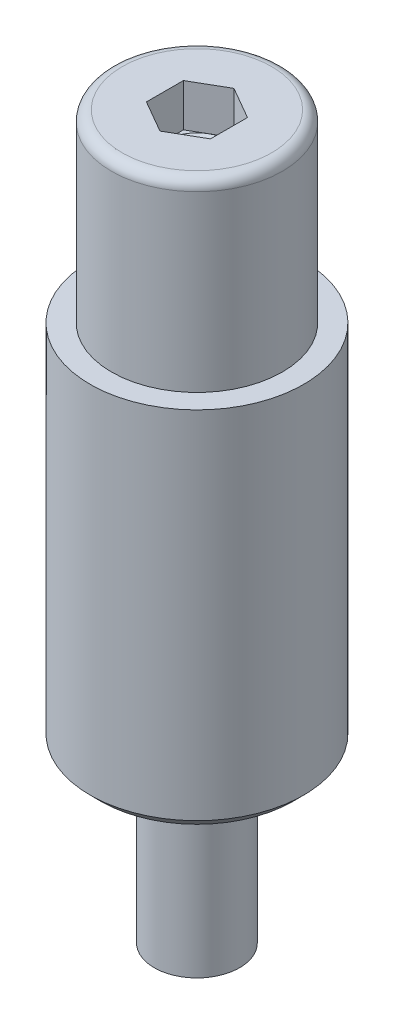
ISO-10303-21;
HEADER;
FILE_DESCRIPTION(('STEP AP214'),'2;1');
FILE_NAME('part.step','',(''),(''),'','','');
FILE_SCHEMA(('AUTOMOTIVE_DESIGN { 1 0 10303 214 1 1 1 1 }'));
ENDSEC;
DATA;
#1=APPLICATION_CONTEXT('core data for automotive mechanical design processes');
#2=APPLICATION_PROTOCOL_DEFINITION('international standard','automotive_design',2000,#1);
#3=PRODUCT_CONTEXT('',#1,'mechanical');
#4=PRODUCT('Part','Part','',(#3));
#5=PRODUCT_RELATED_PRODUCT_CATEGORY('part','',(#4));
#6=PRODUCT_DEFINITION_FORMATION('','',#4);
#7=PRODUCT_DEFINITION_CONTEXT('part definition',#1,'design');
#8=PRODUCT_DEFINITION('design','',#6,#7);
#9=PRODUCT_DEFINITION_SHAPE('','',#8);
#10=(LENGTH_UNIT() NAMED_UNIT(*) SI_UNIT(.MILLI.,.METRE.));
#11=(NAMED_UNIT(*) PLANE_ANGLE_UNIT() SI_UNIT($,.RADIAN.));
#12=(NAMED_UNIT(*) SI_UNIT($,.STERADIAN.) SOLID_ANGLE_UNIT());
#13=UNCERTAINTY_MEASURE_WITH_UNIT(LENGTH_MEASURE(1.E-05),#10,'distance_accuracy_value','');
#14=(GEOMETRIC_REPRESENTATION_CONTEXT(3) GLOBAL_UNCERTAINTY_ASSIGNED_CONTEXT((#13)) GLOBAL_UNIT_ASSIGNED_CONTEXT((#10,
#11,#12)) REPRESENTATION_CONTEXT('',''));
#15=CARTESIAN_POINT('',(0.,0.,0.));
#16=DIRECTION('',(0.,0.,1.));
#17=DIRECTION('',(1.,0.,0.));
#18=AXIS2_PLACEMENT_3D('',#15,#16,#17);
#19=CARTESIAN_POINT('',(0.,23.8,0.));
#20=DIRECTION('',(0.,1.,0.));
#21=DIRECTION('',(0.,0.,1.));
#22=AXIS2_PLACEMENT_3D('',#19,#20,#21);
#23=PLANE('',#22);
#24=DIRECTION('',(-0.866025403784439,0.,-0.5));
#25=VECTOR('',#24,1.);
#26=CARTESIAN_POINT('',(1.5,23.8,-0.86602540378444));
#27=LINE('',#26,#25);
#28=CARTESIAN_POINT('',(1.5,23.8,-0.86602540378444));
#29=VERTEX_POINT('',#28);
#30=CARTESIAN_POINT('',(0.75,23.8,-1.29903810567666));
#31=VERTEX_POINT('',#30);
#32=EDGE_CURVE('E141',#29,#31,#27,.T.);
#33=ORIENTED_EDGE('',*,*,#32,.T.);
#34=CARTESIAN_POINT('',(0.,23.8,0.));
#35=DIRECTION('',(0.,-1.,0.));
#36=DIRECTION('',(0.,0.,-1.));
#37=AXIS2_PLACEMENT_3D('',#34,#35,#36);
#38=CIRCLE('',#37,1.5);
#39=CARTESIAN_POINT('',(1.5,23.8,0.));
#40=VERTEX_POINT('',#39);
#41=EDGE_CURVE('E31',#31,#40,#38,.T.);
#42=ORIENTED_EDGE('',*,*,#41,.T.);
#43=DIRECTION('',(0.,0.,-1.));
#44=VECTOR('',#43,1.);
#45=CARTESIAN_POINT('',(1.5,23.8,0.866025403784439));
#46=LINE('',#45,#44);
#47=EDGE_CURVE('E154',#40,#29,#46,.T.);
#48=ORIENTED_EDGE('',*,*,#47,.T.);
#49=EDGE_LOOP('',(#33,#42,#48));
#50=FACE_BOUND('',#49,.T.);
#51=ADVANCED_FACE('F16',(#50),#23,.T.);
#52=CARTESIAN_POINT('',(1.5,23.8,0.866025403784439));
#53=VERTEX_POINT('',#52);
#54=EDGE_CURVE('E155',#53,#40,#46,.T.);
#55=ORIENTED_EDGE('',*,*,#54,.T.);
#56=CARTESIAN_POINT('',(0.75,23.8,1.29903810567666));
#57=VERTEX_POINT('',#56);
#58=EDGE_CURVE('E204',#40,#57,#38,.T.);
#59=ORIENTED_EDGE('',*,*,#58,.T.);
#60=DIRECTION('',(0.866025403784439,0.,-0.5));
#61=VECTOR('',#60,1.);
#62=CARTESIAN_POINT('',(0.,23.8,1.73205080756887));
#63=LINE('',#62,#61);
#64=EDGE_CURVE('E150',#57,#53,#63,.T.);
#65=ORIENTED_EDGE('',*,*,#64,.T.);
#66=EDGE_LOOP('',(#55,#59,#65));
#67=FACE_BOUND('',#66,.T.);
#68=ADVANCED_FACE('F105',(#67),#23,.T.);
#69=CARTESIAN_POINT('',(0.,23.8,1.73205080756887));
#70=VERTEX_POINT('',#69);
#71=EDGE_CURVE('E151',#70,#57,#63,.T.);
#72=ORIENTED_EDGE('',*,*,#71,.T.);
#73=CARTESIAN_POINT('',(-0.75,23.8,1.29903810567666));
#74=VERTEX_POINT('',#73);
#75=EDGE_CURVE('E208',#57,#74,#38,.T.);
#76=ORIENTED_EDGE('',*,*,#75,.T.);
#77=DIRECTION('',(0.866025403784439,0.,0.5));
#78=VECTOR('',#77,1.);
#79=CARTESIAN_POINT('',(-1.5,23.8,0.866025403784438));
#80=LINE('',#79,#78);
#81=EDGE_CURVE('E146',#74,#70,#80,.T.);
#82=ORIENTED_EDGE('',*,*,#81,.T.);
#83=EDGE_LOOP('',(#72,#76,#82));
#84=FACE_BOUND('',#83,.T.);
#85=ADVANCED_FACE('F112',(#84),#23,.T.);
#86=CARTESIAN_POINT('',(-1.5,23.8,0.866025403784438));
#87=VERTEX_POINT('',#86);
#88=EDGE_CURVE('E147',#87,#74,#80,.T.);
#89=ORIENTED_EDGE('',*,*,#88,.T.);
#90=CARTESIAN_POINT('',(-1.5,23.8,0.));
#91=VERTEX_POINT('',#90);
#92=EDGE_CURVE('E211',#74,#91,#38,.T.);
#93=ORIENTED_EDGE('',*,*,#92,.T.);
#94=DIRECTION('',(0.,0.,1.));
#95=VECTOR('',#94,1.);
#96=CARTESIAN_POINT('',(-1.5,23.8,-0.86602540378444));
#97=LINE('',#96,#95);
#98=EDGE_CURVE('E136',#91,#87,#97,.T.);
#99=ORIENTED_EDGE('',*,*,#98,.T.);
#100=EDGE_LOOP('',(#89,#93,#99));
#101=FACE_BOUND('',#100,.T.);
#102=ADVANCED_FACE('F127',(#101),#23,.T.);
#103=CARTESIAN_POINT('',(-1.5,23.8,-0.86602540378444));
#104=VERTEX_POINT('',#103);
#105=EDGE_CURVE('E139',#104,#91,#97,.T.);
#106=ORIENTED_EDGE('',*,*,#105,.T.);
#107=CARTESIAN_POINT('',(-0.75,23.8,-1.29903810567666));
#108=VERTEX_POINT('',#107);
#109=EDGE_CURVE('E213',#91,#108,#38,.T.);
#110=ORIENTED_EDGE('',*,*,#109,.T.);
#111=DIRECTION('',(-0.866025403784439,0.,0.5));
#112=VECTOR('',#111,1.);
#113=CARTESIAN_POINT('',(0.,23.8,-1.73205080756888));
#114=LINE('',#113,#112);
#115=EDGE_CURVE('E137',#108,#104,#114,.T.);
#116=ORIENTED_EDGE('',*,*,#115,.T.);
#117=EDGE_LOOP('',(#106,#110,#116));
#118=FACE_BOUND('',#117,.T.);
#119=ADVANCED_FACE('F118',(#118),#23,.T.);
#120=CARTESIAN_POINT('',(0.,23.8,-1.73205080756888));
#121=VERTEX_POINT('',#120);
#122=EDGE_CURVE('E131',#121,#108,#114,.T.);
#123=ORIENTED_EDGE('',*,*,#122,.T.);
#124=EDGE_CURVE('E132',#108,#31,#38,.T.);
#125=ORIENTED_EDGE('',*,*,#124,.T.);
#126=EDGE_CURVE('E134',#31,#121,#27,.T.);
#127=ORIENTED_EDGE('',*,*,#126,.T.);
#128=EDGE_LOOP('',(#123,#125,#127));
#129=FACE_BOUND('',#128,.T.);
#130=ADVANCED_FACE('F107',(#129),#23,.T.);
#131=CARTESIAN_POINT('',(2.,0.,0.));
#132=DIRECTION('',(0.,1.,0.));
#133=DIRECTION('',(-1.,0.,0.));
#134=AXIS2_PLACEMENT_3D('',#131,#132,#133);
#135=PLANE('',#134);
#136=CARTESIAN_POINT('',(0.,0.,0.));
#137=DIRECTION('',(0.,1.,0.));
#138=DIRECTION('',(-1.,0.,0.));
#139=AXIS2_PLACEMENT_3D('',#136,#137,#138);
#140=CIRCLE('',#139,4.5);
#141=CARTESIAN_POINT('',(-4.5,0.,0.));
#142=VERTEX_POINT('',#141);
#143=EDGE_CURVE('E11',#142,#142,#140,.F.);
#144=ORIENTED_EDGE('',*,*,#143,.T.);
#145=EDGE_LOOP('',(#144));
#146=FACE_BOUND('',#145,.T.);
#147=CARTESIAN_POINT('',(0.,0.,0.));
#148=DIRECTION('',(0.,1.,0.));
#149=DIRECTION('',(-1.,0.,0.));
#150=AXIS2_PLACEMENT_3D('',#147,#148,#149);
#151=CIRCLE('',#150,2.);
#152=CARTESIAN_POINT('',(-2.,0.,0.));
#153=VERTEX_POINT('',#152);
#154=EDGE_CURVE('E177',#153,#153,#151,.T.);
#155=ORIENTED_EDGE('',*,*,#154,.T.);
#156=EDGE_LOOP('',(#155));
#157=FACE_BOUND('',#156,.T.);
#158=ADVANCED_FACE('F117',(#146,#157),#135,.F.);
#159=CARTESIAN_POINT('',(0.,25.8,0.));
#160=DIRECTION('',(0.,1.,0.));
#161=DIRECTION('',(-1.,0.,0.));
#162=AXIS2_PLACEMENT_3D('',#159,#160,#161);
#163=CYLINDRICAL_SURFACE('',#162,5.);
#164=CARTESIAN_POINT('',(0.,0.5,0.));
#165=DIRECTION('',(0.,1.,0.));
#166=DIRECTION('',(-1.,0.,0.));
#167=AXIS2_PLACEMENT_3D('',#164,#165,#166);
#168=CIRCLE('',#167,5.);
#169=CARTESIAN_POINT('',(-5.,0.499999999999999,0.));
#170=VERTEX_POINT('',#169);
#171=EDGE_CURVE('E24',#170,#170,#168,.T.);
#172=ORIENTED_EDGE('',*,*,#171,.T.);
#173=EDGE_LOOP('',(#172));
#174=FACE_BOUND('',#173,.T.);
#175=CARTESIAN_POINT('',(0.,17.16,0.));
#176=DIRECTION('',(0.,1.,0.));
#177=DIRECTION('',(-1.,0.,0.));
#178=AXIS2_PLACEMENT_3D('',#175,#176,#177);
#179=CIRCLE('',#178,5.);
#180=CARTESIAN_POINT('',(-5.,17.16,0.));
#181=VERTEX_POINT('',#180);
#182=EDGE_CURVE('E201',#181,#181,#179,.T.);
#183=ORIENTED_EDGE('',*,*,#182,.F.);
#184=EDGE_LOOP('',(#183));
#185=FACE_BOUND('',#184,.T.);
#186=ADVANCED_FACE('F125',(#174,#185),#163,.T.);
#187=CARTESIAN_POINT('',(5.,17.16,0.));
#188=DIRECTION('',(0.,-1.,0.));
#189=DIRECTION('',(1.,0.,0.));
#190=AXIS2_PLACEMENT_3D('',#187,#188,#189);
#191=PLANE('',#190);
#192=CARTESIAN_POINT('',(0.,17.16,0.));
#193=DIRECTION('',(0.,1.,0.));
#194=DIRECTION('',(-1.,0.,0.));
#195=AXIS2_PLACEMENT_3D('',#192,#193,#194);
#196=CIRCLE('',#195,4.);
#197=CARTESIAN_POINT('',(-4.,17.16,0.));
#198=VERTEX_POINT('',#197);
#199=EDGE_CURVE('E198',#198,#198,#196,.T.);
#200=ORIENTED_EDGE('',*,*,#199,.F.);
#201=EDGE_LOOP('',(#200));
#202=FACE_BOUND('',#201,.T.);
#203=ORIENTED_EDGE('',*,*,#182,.T.);
#204=EDGE_LOOP('',(#203));
#205=FACE_BOUND('',#204,.T.);
#206=ADVANCED_FACE('F272',(#202,#205),#191,.F.);
#207=CARTESIAN_POINT('',(0.,25.8,0.));
#208=DIRECTION('',(0.,1.,0.));
#209=DIRECTION('',(-1.,0.,0.));
#210=AXIS2_PLACEMENT_3D('',#207,#208,#209);
#211=CYLINDRICAL_SURFACE('',#210,4.);
#212=CARTESIAN_POINT('',(0.,25.3,0.));
#213=DIRECTION('',(0.,1.,0.));
#214=DIRECTION('',(-1.,0.,0.));
#215=AXIS2_PLACEMENT_3D('',#212,#213,#214);
#216=CIRCLE('',#215,4.);
#217=CARTESIAN_POINT('',(-4.,25.3,0.));
#218=VERTEX_POINT('',#217);
#219=EDGE_CURVE('E195',#218,#218,#216,.T.);
#220=ORIENTED_EDGE('',*,*,#219,.F.);
#221=EDGE_LOOP('',(#220));
#222=FACE_BOUND('',#221,.T.);
#223=ORIENTED_EDGE('',*,*,#199,.T.);
#224=EDGE_LOOP('',(#223));
#225=FACE_BOUND('',#224,.T.);
#226=ADVANCED_FACE('F268',(#222,#225),#211,.T.);
#227=CARTESIAN_POINT('',(0.,25.3,0.));
#228=DIRECTION('',(0.,1.,0.));
#229=DIRECTION('',(-1.,0.,0.));
#230=AXIS2_PLACEMENT_3D('',#227,#228,#229);
#231=TOROIDAL_SURFACE('',#230,3.5,0.5);
#232=CARTESIAN_POINT('',(0.,25.8,0.));
#233=DIRECTION('',(0.,1.,0.));
#234=DIRECTION('',(-1.,0.,0.));
#235=AXIS2_PLACEMENT_3D('',#232,#233,#234);
#236=CIRCLE('',#235,3.5);
#237=CARTESIAN_POINT('',(-3.5,25.8,0.));
#238=VERTEX_POINT('',#237);
#239=EDGE_CURVE('E192',#238,#238,#236,.T.);
#240=ORIENTED_EDGE('',*,*,#239,.F.);
#241=EDGE_LOOP('',(#240));
#242=FACE_BOUND('',#241,.T.);
#243=ORIENTED_EDGE('',*,*,#219,.T.);
#244=EDGE_LOOP('',(#243));
#245=FACE_BOUND('',#244,.T.);
#246=ADVANCED_FACE('F265',(#242,#245),#231,.T.);
#247=CARTESIAN_POINT('',(3.5,25.8,0.));
#248=DIRECTION('',(0.,-1.,0.));
#249=DIRECTION('',(1.,0.,0.));
#250=AXIS2_PLACEMENT_3D('',#247,#248,#249);
#251=PLANE('',#250);
#252=DIRECTION('',(-0.866025403784439,0.,0.5));
#253=VECTOR('',#252,1.);
#254=CARTESIAN_POINT('',(0.,25.8,-1.73205080756888));
#255=LINE('',#254,#253);
#256=CARTESIAN_POINT('',(0.,25.8,-1.73205080756888));
#257=VERTEX_POINT('',#256);
#258=CARTESIAN_POINT('',(-1.5,25.8,-0.86602540378444));
#259=VERTEX_POINT('',#258);
#260=EDGE_CURVE('E160',#257,#259,#255,.T.);
#261=ORIENTED_EDGE('',*,*,#260,.F.);
#262=DIRECTION('',(-0.866025403784439,0.,-0.5));
#263=VECTOR('',#262,1.);
#264=CARTESIAN_POINT('',(1.5,25.8,-0.86602540378444));
#265=LINE('',#264,#263);
#266=CARTESIAN_POINT('',(1.5,25.8,-0.86602540378444));
#267=VERTEX_POINT('',#266);
#268=EDGE_CURVE('E39',#267,#257,#265,.T.);
#269=ORIENTED_EDGE('',*,*,#268,.F.);
#270=DIRECTION('',(0.,0.,-1.));
#271=VECTOR('',#270,1.);
#272=CARTESIAN_POINT('',(1.5,25.8,0.866025403784439));
#273=LINE('',#272,#271);
#274=CARTESIAN_POINT('',(1.5,25.8,0.866025403784439));
#275=VERTEX_POINT('',#274);
#276=EDGE_CURVE('E172',#275,#267,#273,.T.);
#277=ORIENTED_EDGE('',*,*,#276,.F.);
#278=DIRECTION('',(0.866025403784439,0.,-0.5));
#279=VECTOR('',#278,1.);
#280=CARTESIAN_POINT('',(0.,25.8,1.73205080756887));
#281=LINE('',#280,#279);
#282=CARTESIAN_POINT('',(0.,25.8,1.73205080756887));
#283=VERTEX_POINT('',#282);
#284=EDGE_CURVE('E169',#283,#275,#281,.T.);
#285=ORIENTED_EDGE('',*,*,#284,.F.);
#286=DIRECTION('',(0.866025403784439,0.,0.5));
#287=VECTOR('',#286,1.);
#288=CARTESIAN_POINT('',(-1.5,25.8,0.866025403784438));
#289=LINE('',#288,#287);
#290=CARTESIAN_POINT('',(-1.5,25.8,0.866025403784438));
#291=VERTEX_POINT('',#290);
#292=EDGE_CURVE('E166',#291,#283,#289,.T.);
#293=ORIENTED_EDGE('',*,*,#292,.F.);
#294=DIRECTION('',(0.,0.,1.));
#295=VECTOR('',#294,1.);
#296=CARTESIAN_POINT('',(-1.5,25.8,-0.86602540378444));
#297=LINE('',#296,#295);
#298=EDGE_CURVE('E163',#259,#291,#297,.T.);
#299=ORIENTED_EDGE('',*,*,#298,.F.);
#300=EDGE_LOOP('',(#261,#269,#277,#285,#293,#299));
#301=FACE_BOUND('',#300,.T.);
#302=ORIENTED_EDGE('',*,*,#239,.T.);
#303=EDGE_LOOP('',(#302));
#304=FACE_BOUND('',#303,.T.);
#305=ADVANCED_FACE('F228',(#301,#304),#251,.F.);
#306=CARTESIAN_POINT('',(0.,-8.,0.));
#307=DIRECTION('',(0.,1.,0.));
#308=DIRECTION('',(-1.,0.,0.));
#309=AXIS2_PLACEMENT_3D('',#306,#307,#308);
#310=PLANE('',#309);
#311=CARTESIAN_POINT('',(0.,-8.,0.));
#312=DIRECTION('',(0.,1.,0.));
#313=DIRECTION('',(-1.,0.,0.));
#314=AXIS2_PLACEMENT_3D('',#311,#312,#313);
#315=CIRCLE('',#314,2.);
#316=CARTESIAN_POINT('',(-2.,-8.,0.));
#317=VERTEX_POINT('',#316);
#318=EDGE_CURVE('E189',#317,#317,#315,.T.);
#319=ORIENTED_EDGE('',*,*,#318,.F.);
#320=EDGE_LOOP('',(#319));
#321=FACE_BOUND('',#320,.T.);
#322=ADVANCED_FACE('F255',(#321),#310,.F.);
#323=CARTESIAN_POINT('',(0.,25.8,0.));
#324=DIRECTION('',(0.,1.,0.));
#325=DIRECTION('',(-1.,0.,0.));
#326=AXIS2_PLACEMENT_3D('',#323,#324,#325);
#327=CYLINDRICAL_SURFACE('',#326,2.);
#328=ORIENTED_EDGE('',*,*,#154,.F.);
#329=EDGE_LOOP('',(#328));
#330=FACE_BOUND('',#329,.T.);
#331=ORIENTED_EDGE('',*,*,#318,.T.);
#332=EDGE_LOOP('',(#331));
#333=FACE_BOUND('',#332,.T.);
#334=ADVANCED_FACE('F247',(#330,#333),#327,.T.);
#335=CARTESIAN_POINT('',(1.5,23.8,-0.86602540378444));
#336=DIRECTION('',(0.5,0.,-0.866025403784439));
#337=DIRECTION('',(-0.866025403784439,0.,-0.5));
#338=AXIS2_PLACEMENT_3D('',#335,#336,#337);
#339=PLANE('',#338);
#340=ORIENTED_EDGE('',*,*,#268,.T.);
#341=DIRECTION('',(0.,1.,0.));
#342=VECTOR('',#341,1.);
#343=CARTESIAN_POINT('',(0.,23.8,-1.73205080756888));
#344=LINE('',#343,#342);
#345=EDGE_CURVE('E158',#121,#257,#344,.T.);
#346=ORIENTED_EDGE('',*,*,#345,.F.);
#347=ORIENTED_EDGE('',*,*,#126,.F.);
#348=ORIENTED_EDGE('',*,*,#32,.F.);
#349=DIRECTION('',(0.,1.,0.));
#350=VECTOR('',#349,1.);
#351=CARTESIAN_POINT('',(1.5,23.8,-0.86602540378444));
#352=LINE('',#351,#350);
#353=EDGE_CURVE('E175',#29,#267,#352,.T.);
#354=ORIENTED_EDGE('',*,*,#353,.T.);
#355=EDGE_LOOP('',(#340,#346,#347,#348,#354));
#356=FACE_BOUND('',#355,.T.);
#357=ADVANCED_FACE('F245',(#356),#339,.F.);
#358=CARTESIAN_POINT('',(1.5,23.8,0.866025403784439));
#359=DIRECTION('',(1.,0.,0.));
#360=DIRECTION('',(0.,0.,-1.));
#361=AXIS2_PLACEMENT_3D('',#358,#359,#360);
#362=PLANE('',#361);
#363=ORIENTED_EDGE('',*,*,#276,.T.);
#364=ORIENTED_EDGE('',*,*,#353,.F.);
#365=ORIENTED_EDGE('',*,*,#47,.F.);
#366=ORIENTED_EDGE('',*,*,#54,.F.);
#367=DIRECTION('',(0.,1.,0.));
#368=VECTOR('',#367,1.);
#369=CARTESIAN_POINT('',(1.5,23.8,0.866025403784439));
#370=LINE('',#369,#368);
#371=EDGE_CURVE('E178',#53,#275,#370,.T.);
#372=ORIENTED_EDGE('',*,*,#371,.T.);
#373=EDGE_LOOP('',(#363,#364,#365,#366,#372));
#374=FACE_BOUND('',#373,.T.);
#375=ADVANCED_FACE('F242',(#374),#362,.F.);
#376=CARTESIAN_POINT('',(0.,23.8,1.73205080756887));
#377=DIRECTION('',(0.5,0.,0.866025403784439));
#378=DIRECTION('',(0.866025403784439,0.,-0.5));
#379=AXIS2_PLACEMENT_3D('',#376,#377,#378);
#380=PLANE('',#379);
#381=ORIENTED_EDGE('',*,*,#284,.T.);
#382=ORIENTED_EDGE('',*,*,#371,.F.);
#383=ORIENTED_EDGE('',*,*,#64,.F.);
#384=ORIENTED_EDGE('',*,*,#71,.F.);
#385=DIRECTION('',(0.,1.,0.));
#386=VECTOR('',#385,1.);
#387=CARTESIAN_POINT('',(0.,23.8,1.73205080756887));
#388=LINE('',#387,#386);
#389=EDGE_CURVE('E180',#70,#283,#388,.T.);
#390=ORIENTED_EDGE('',*,*,#389,.T.);
#391=EDGE_LOOP('',(#381,#382,#383,#384,#390));
#392=FACE_BOUND('',#391,.T.);
#393=ADVANCED_FACE('F238',(#392),#380,.F.);
#394=CARTESIAN_POINT('',(-1.5,23.8,0.866025403784438));
#395=DIRECTION('',(-0.5,0.,0.866025403784439));
#396=DIRECTION('',(0.866025403784439,0.,0.5));
#397=AXIS2_PLACEMENT_3D('',#394,#395,#396);
#398=PLANE('',#397);
#399=ORIENTED_EDGE('',*,*,#292,.T.);
#400=ORIENTED_EDGE('',*,*,#389,.F.);
#401=ORIENTED_EDGE('',*,*,#81,.F.);
#402=ORIENTED_EDGE('',*,*,#88,.F.);
#403=DIRECTION('',(0.,1.,0.));
#404=VECTOR('',#403,1.);
#405=CARTESIAN_POINT('',(-1.5,23.8,0.866025403784438));
#406=LINE('',#405,#404);
#407=EDGE_CURVE('E182',#87,#291,#406,.T.);
#408=ORIENTED_EDGE('',*,*,#407,.T.);
#409=EDGE_LOOP('',(#399,#400,#401,#402,#408));
#410=FACE_BOUND('',#409,.T.);
#411=ADVANCED_FACE('F233',(#410),#398,.F.);
#412=CARTESIAN_POINT('',(-1.5,23.8,-0.86602540378444));
#413=DIRECTION('',(-1.,0.,0.));
#414=DIRECTION('',(0.,0.,1.));
#415=AXIS2_PLACEMENT_3D('',#412,#413,#414);
#416=PLANE('',#415);
#417=ORIENTED_EDGE('',*,*,#298,.T.);
#418=ORIENTED_EDGE('',*,*,#407,.F.);
#419=ORIENTED_EDGE('',*,*,#98,.F.);
#420=ORIENTED_EDGE('',*,*,#105,.F.);
#421=DIRECTION('',(0.,1.,0.));
#422=VECTOR('',#421,1.);
#423=CARTESIAN_POINT('',(-1.5,23.8,-0.86602540378444));
#424=LINE('',#423,#422);
#425=EDGE_CURVE('E184',#104,#259,#424,.T.);
#426=ORIENTED_EDGE('',*,*,#425,.T.);
#427=EDGE_LOOP('',(#417,#418,#419,#420,#426));
#428=FACE_BOUND('',#427,.T.);
#429=ADVANCED_FACE('F100',(#428),#416,.F.);
#430=CARTESIAN_POINT('',(0.,23.8,-1.73205080756888));
#431=DIRECTION('',(-0.5,0.,-0.866025403784439));
#432=DIRECTION('',(-0.866025403784439,0.,0.5));
#433=AXIS2_PLACEMENT_3D('',#430,#431,#432);
#434=PLANE('',#433);
#435=ORIENTED_EDGE('',*,*,#260,.T.);
#436=ORIENTED_EDGE('',*,*,#425,.F.);
#437=ORIENTED_EDGE('',*,*,#115,.F.);
#438=ORIENTED_EDGE('',*,*,#122,.F.);
#439=ORIENTED_EDGE('',*,*,#345,.T.);
#440=EDGE_LOOP('',(#435,#436,#437,#438,#439));
#441=FACE_BOUND('',#440,.T.);
#442=ADVANCED_FACE('F91',(#441),#434,.F.);
#443=CARTESIAN_POINT('',(0.,22.9339745962156,0.));
#444=DIRECTION('',(0.,1.,0.));
#445=DIRECTION('',(0.,0.,1.));
#446=AXIS2_PLACEMENT_3D('',#443,#444,#445);
#447=CONICAL_SURFACE('',#446,0.,1.0471975511966);
#448=ORIENTED_EDGE('',*,*,#41,.F.);
#449=ORIENTED_EDGE('',*,*,#124,.F.);
#450=ORIENTED_EDGE('',*,*,#109,.F.);
#451=ORIENTED_EDGE('',*,*,#92,.F.);
#452=ORIENTED_EDGE('',*,*,#75,.F.);
#453=ORIENTED_EDGE('',*,*,#58,.F.);
#454=EDGE_LOOP('',(#448,#449,#450,#451,#452,#453));
#455=FACE_BOUND('',#454,.T.);
#456=CARTESIAN_POINT('',(0.,22.9339745962156,0.));
#457=VERTEX_POINT('',#456);
#458=VERTEX_LOOP('',#457);
#459=FACE_BOUND('',#458,.T.);
#460=ADVANCED_FACE('F89',(#455,#459),#447,.F.);
#461=CARTESIAN_POINT('',(0.,0.5,0.));
#462=DIRECTION('',(0.,1.,0.));
#463=DIRECTION('',(-1.,0.,0.));
#464=AXIS2_PLACEMENT_3D('',#461,#462,#463);
#465=CONICAL_SURFACE('',#464,5.,0.785398163397451);
#466=ORIENTED_EDGE('',*,*,#143,.F.);
#467=EDGE_LOOP('',(#466));
#468=FACE_BOUND('',#467,.T.);
#469=ORIENTED_EDGE('',*,*,#171,.F.);
#470=EDGE_LOOP('',(#469));
#471=FACE_BOUND('',#470,.T.);
#472=ADVANCED_FACE('F18',(#468,#471),#465,.T.);
#473=CLOSED_SHELL('',(#51,#68,#85,#102,#119,#130,#158,#186,#206,#226,#246,#305,#322,#334,#357,
#375,#393,#411,#429,#442,#460,#472));
#474=MANIFOLD_SOLID_BREP('B1',#473);
#475=ADVANCED_BREP_SHAPE_REPRESENTATION('',(#18,#474),#14);
#476=SHAPE_DEFINITION_REPRESENTATION(#9,#475);
ENDSEC;
END-ISO-10303-21;
